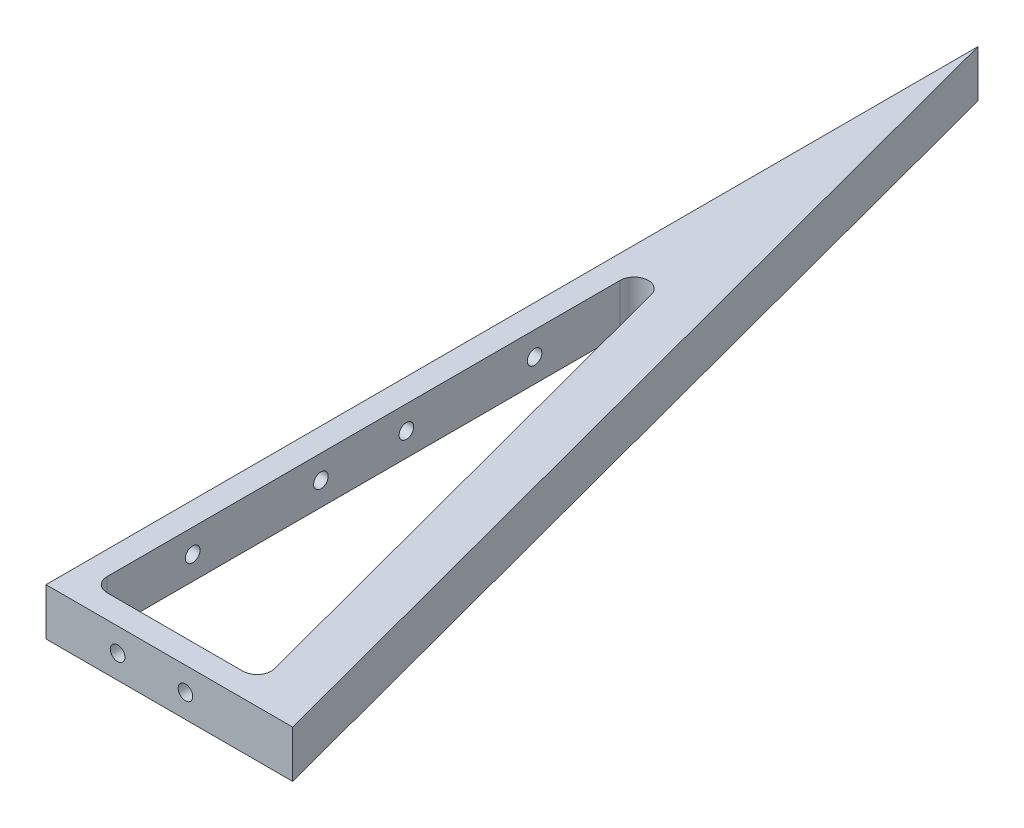
ISO-10303-21;
HEADER;
FILE_DESCRIPTION(('STEP AP214'),'2;1');
FILE_NAME('part.step','',(''),(''),'','','');
FILE_SCHEMA(('AUTOMOTIVE_DESIGN { 1 0 10303 214 1 1 1 1 }'));
ENDSEC;
DATA;
#1=APPLICATION_CONTEXT('core data for automotive mechanical design processes');
#2=APPLICATION_PROTOCOL_DEFINITION('international standard','automotive_design',2000,#1);
#3=PRODUCT_CONTEXT('',#1,'mechanical');
#4=PRODUCT('Part','Part','',(#3));
#5=PRODUCT_RELATED_PRODUCT_CATEGORY('part','',(#4));
#6=PRODUCT_DEFINITION_FORMATION('','',#4);
#7=PRODUCT_DEFINITION_CONTEXT('part definition',#1,'design');
#8=PRODUCT_DEFINITION('design','',#6,#7);
#9=PRODUCT_DEFINITION_SHAPE('','',#8);
#10=(LENGTH_UNIT() NAMED_UNIT(*) SI_UNIT(.MILLI.,.METRE.));
#11=(NAMED_UNIT(*) PLANE_ANGLE_UNIT() SI_UNIT($,.RADIAN.));
#12=(NAMED_UNIT(*) SI_UNIT($,.STERADIAN.) SOLID_ANGLE_UNIT());
#13=UNCERTAINTY_MEASURE_WITH_UNIT(LENGTH_MEASURE(1.E-05),#10,'distance_accuracy_value','');
#14=(GEOMETRIC_REPRESENTATION_CONTEXT(3) GLOBAL_UNCERTAINTY_ASSIGNED_CONTEXT((#13)) GLOBAL_UNIT_ASSIGNED_CONTEXT((#10,
#11,#12)) REPRESENTATION_CONTEXT('',''));
#15=CARTESIAN_POINT('',(0.,0.,0.));
#16=DIRECTION('',(0.,0.,1.));
#17=DIRECTION('',(1.,0.,0.));
#18=AXIS2_PLACEMENT_3D('',#15,#16,#17);
#19=CARTESIAN_POINT('',(0.,10.,0.));
#20=DIRECTION('',(0.,-1.,0.));
#21=DIRECTION('',(0.,0.,-1.));
#22=AXIS2_PLACEMENT_3D('',#19,#20,#21);
#23=PLANE('',#22);
#24=DIRECTION('',(1.,0.,0.));
#25=VECTOR('',#24,1.);
#26=CARTESIAN_POINT('',(52.4,10.,0.));
#27=LINE('',#26,#25);
#28=CARTESIAN_POINT('',(0.,10.,0.));
#29=VERTEX_POINT('',#28);
#30=CARTESIAN_POINT('',(52.4,10.,0.));
#31=VERTEX_POINT('',#30);
#32=EDGE_CURVE('E157',#29,#31,#27,.T.);
#33=ORIENTED_EDGE('',*,*,#32,.T.);
#34=DIRECTION('',(-0.255838880915375,0.,-0.966719435519928));
#35=VECTOR('',#34,1.);
#36=CARTESIAN_POINT('',(0.,10.,-198.));
#37=LINE('',#36,#35);
#38=CARTESIAN_POINT('',(0.,10.,-198.));
#39=VERTEX_POINT('',#38);
#40=EDGE_CURVE('E160',#31,#39,#37,.T.);
#41=ORIENTED_EDGE('',*,*,#40,.T.);
#42=DIRECTION('',(0.,0.,1.));
#43=VECTOR('',#42,1.);
#44=CARTESIAN_POINT('',(0.,10.,0.));
#45=LINE('',#44,#43);
#46=EDGE_CURVE('E163',#39,#29,#45,.T.);
#47=ORIENTED_EDGE('',*,*,#46,.T.);
#48=EDGE_LOOP('',(#33,#41,#47));
#49=FACE_BOUND('',#48,.T.);
#50=CARTESIAN_POINT('',(8.,10.,-116.957761971224));
#51=DIRECTION('',(0.,1.,0.));
#52=DIRECTION('',(0.,0.,-1.));
#53=AXIS2_PLACEMENT_3D('',#50,#51,#52);
#54=CIRCLE('',#53,3.);
#55=CARTESIAN_POINT('',(10.9001583065598,10.,-117.72527861397));
#56=VERTEX_POINT('',#55);
#57=CARTESIAN_POINT('',(5.,10.,-116.957761971224));
#58=VERTEX_POINT('',#57);
#59=EDGE_CURVE('E104',#56,#58,#54,.T.);
#60=ORIENTED_EDGE('',*,*,#59,.F.);
#61=DIRECTION('',(-0.255838880915375,0.,-0.966719435519928));
#62=VECTOR('',#61,1.);
#63=CARTESIAN_POINT('',(10.9001583065598,10.,-117.72527861397));
#64=LINE('',#63,#62);
#65=CARTESIAN_POINT('',(39.7354448080353,10.,-8.76751664274612));
#66=VERTEX_POINT('',#65);
#67=EDGE_CURVE('E134',#66,#56,#64,.T.);
#68=ORIENTED_EDGE('',*,*,#67,.F.);
#69=CARTESIAN_POINT('',(36.8352865014755,10.,-8.));
#70=DIRECTION('',(0.,1.,0.));
#71=DIRECTION('',(0.,0.,-1.));
#72=AXIS2_PLACEMENT_3D('',#69,#70,#71);
#73=CIRCLE('',#72,3.);
#74=CARTESIAN_POINT('',(36.8352865014755,10.,-5.));
#75=VERTEX_POINT('',#74);
#76=EDGE_CURVE('E132',#75,#66,#73,.T.);
#77=ORIENTED_EDGE('',*,*,#76,.F.);
#78=DIRECTION('',(1.,0.,0.));
#79=VECTOR('',#78,1.);
#80=CARTESIAN_POINT('',(36.8352865014755,10.,-5.));
#81=LINE('',#80,#79);
#82=CARTESIAN_POINT('',(8.,10.,-5.));
#83=VERTEX_POINT('',#82);
#84=EDGE_CURVE('E127',#83,#75,#81,.T.);
#85=ORIENTED_EDGE('',*,*,#84,.F.);
#86=CARTESIAN_POINT('',(8.,10.,-7.99999999999999));
#87=DIRECTION('',(0.,1.,0.));
#88=DIRECTION('',(0.,0.,1.));
#89=AXIS2_PLACEMENT_3D('',#86,#87,#88);
#90=CIRCLE('',#89,3.);
#91=CARTESIAN_POINT('',(5.,10.,-8.00000000000002));
#92=VERTEX_POINT('',#91);
#93=EDGE_CURVE('E125',#92,#83,#90,.T.);
#94=ORIENTED_EDGE('',*,*,#93,.F.);
#95=DIRECTION('',(0.,0.,1.));
#96=VECTOR('',#95,1.);
#97=CARTESIAN_POINT('',(5.,10.,-8.00000000000002));
#98=LINE('',#97,#96);
#99=EDGE_CURVE('E112',#58,#92,#98,.T.);
#100=ORIENTED_EDGE('',*,*,#99,.F.);
#101=EDGE_LOOP('',(#60,#68,#77,#85,#94,#100));
#102=FACE_BOUND('',#101,.T.);
#103=ADVANCED_FACE('F33',(#49,#102),#23,.F.);
#104=CARTESIAN_POINT('',(0.,0.,0.));
#105=DIRECTION('',(0.,-1.,0.));
#106=DIRECTION('',(0.,0.,-1.));
#107=AXIS2_PLACEMENT_3D('',#104,#105,#106);
#108=PLANE('',#107);
#109=DIRECTION('',(1.,0.,0.));
#110=VECTOR('',#109,1.);
#111=CARTESIAN_POINT('',(52.4,0.,0.));
#112=LINE('',#111,#110);
#113=CARTESIAN_POINT('',(0.,0.,0.));
#114=VERTEX_POINT('',#113);
#115=CARTESIAN_POINT('',(52.4,0.,0.));
#116=VERTEX_POINT('',#115);
#117=EDGE_CURVE('E120',#114,#116,#112,.T.);
#118=ORIENTED_EDGE('',*,*,#117,.F.);
#119=DIRECTION('',(0.,0.,1.));
#120=VECTOR('',#119,1.);
#121=CARTESIAN_POINT('',(0.,0.,0.));
#122=LINE('',#121,#120);
#123=CARTESIAN_POINT('',(0.,0.,-198.));
#124=VERTEX_POINT('',#123);
#125=EDGE_CURVE('E161',#124,#114,#122,.T.);
#126=ORIENTED_EDGE('',*,*,#125,.F.);
#127=DIRECTION('',(-0.255838880915375,0.,-0.966719435519928));
#128=VECTOR('',#127,1.);
#129=CARTESIAN_POINT('',(0.,0.,-198.));
#130=LINE('',#129,#128);
#131=EDGE_CURVE('E168',#116,#124,#130,.T.);
#132=ORIENTED_EDGE('',*,*,#131,.F.);
#133=EDGE_LOOP('',(#118,#126,#132));
#134=FACE_BOUND('',#133,.T.);
#135=DIRECTION('',(-0.255838880915375,0.,-0.966719435519928));
#136=VECTOR('',#135,1.);
#137=CARTESIAN_POINT('',(10.9001583065598,0.,-117.72527861397));
#138=LINE('',#137,#136);
#139=CARTESIAN_POINT('',(39.7354448080353,0.,-8.76751664274612));
#140=VERTEX_POINT('',#139);
#141=CARTESIAN_POINT('',(10.9001583065598,0.,-117.72527861397));
#142=VERTEX_POINT('',#141);
#143=EDGE_CURVE('E113',#140,#142,#138,.T.);
#144=ORIENTED_EDGE('',*,*,#143,.T.);
#145=CARTESIAN_POINT('',(8.,0.,-116.957761971224));
#146=DIRECTION('',(0.,1.,0.));
#147=DIRECTION('',(0.,0.,-1.));
#148=AXIS2_PLACEMENT_3D('',#145,#146,#147);
#149=CIRCLE('',#148,3.);
#150=CARTESIAN_POINT('',(5.,0.,-116.957761971224));
#151=VERTEX_POINT('',#150);
#152=EDGE_CURVE('E56',#142,#151,#149,.T.);
#153=ORIENTED_EDGE('',*,*,#152,.T.);
#154=DIRECTION('',(0.,0.,1.));
#155=VECTOR('',#154,1.);
#156=CARTESIAN_POINT('',(5.,0.,-8.00000000000002));
#157=LINE('',#156,#155);
#158=CARTESIAN_POINT('',(5.,0.,-8.00000000000002));
#159=VERTEX_POINT('',#158);
#160=EDGE_CURVE('E119',#151,#159,#157,.T.);
#161=ORIENTED_EDGE('',*,*,#160,.T.);
#162=CARTESIAN_POINT('',(8.,0.,-7.99999999999999));
#163=DIRECTION('',(0.,1.,0.));
#164=DIRECTION('',(0.,0.,1.));
#165=AXIS2_PLACEMENT_3D('',#162,#163,#164);
#166=CIRCLE('',#165,3.);
#167=CARTESIAN_POINT('',(8.,0.,-5.));
#168=VERTEX_POINT('',#167);
#169=EDGE_CURVE('E139',#159,#168,#166,.T.);
#170=ORIENTED_EDGE('',*,*,#169,.T.);
#171=DIRECTION('',(1.,0.,0.));
#172=VECTOR('',#171,1.);
#173=CARTESIAN_POINT('',(36.8352865014755,0.,-5.));
#174=LINE('',#173,#172);
#175=CARTESIAN_POINT('',(36.8352865014755,0.,-5.));
#176=VERTEX_POINT('',#175);
#177=EDGE_CURVE('E142',#168,#176,#174,.T.);
#178=ORIENTED_EDGE('',*,*,#177,.T.);
#179=CARTESIAN_POINT('',(36.8352865014755,0.,-8.));
#180=DIRECTION('',(0.,1.,0.));
#181=DIRECTION('',(0.,0.,-1.));
#182=AXIS2_PLACEMENT_3D('',#179,#180,#181);
#183=CIRCLE('',#182,3.);
#184=EDGE_CURVE('E145',#176,#140,#183,.T.);
#185=ORIENTED_EDGE('',*,*,#184,.T.);
#186=EDGE_LOOP('',(#144,#153,#161,#170,#178,#185));
#187=FACE_BOUND('',#186,.T.);
#188=ADVANCED_FACE('F182',(#134,#187),#108,.T.);
#189=CARTESIAN_POINT('',(52.4,10.,0.));
#190=DIRECTION('',(0.,0.,-1.));
#191=DIRECTION('',(-1.,0.,0.));
#192=AXIS2_PLACEMENT_3D('',#189,#190,#191);
#193=PLANE('',#192);
#194=CARTESIAN_POINT('',(15.2076432507378,5.,0.));
#195=DIRECTION('',(0.,0.,-1.));
#196=DIRECTION('',(-1.,0.,0.));
#197=AXIS2_PLACEMENT_3D('',#194,#195,#196);
#198=CIRCLE('',#197,1.55);
#199=CARTESIAN_POINT('',(13.6576432507378,5.,0.));
#200=VERTEX_POINT('',#199);
#201=EDGE_CURVE('E137',#200,#200,#198,.T.);
#202=ORIENTED_EDGE('',*,*,#201,.T.);
#203=EDGE_LOOP('',(#202));
#204=FACE_BOUND('',#203,.T.);
#205=CARTESIAN_POINT('',(29.6276432507378,5.,0.));
#206=DIRECTION('',(0.,0.,-1.));
#207=DIRECTION('',(-1.,0.,0.));
#208=AXIS2_PLACEMENT_3D('',#205,#206,#207);
#209=CIRCLE('',#208,1.55);
#210=CARTESIAN_POINT('',(28.0776432507378,5.,0.));
#211=VERTEX_POINT('',#210);
#212=EDGE_CURVE('E268',#211,#211,#209,.T.);
#213=ORIENTED_EDGE('',*,*,#212,.T.);
#214=EDGE_LOOP('',(#213));
#215=FACE_BOUND('',#214,.T.);
#216=ORIENTED_EDGE('',*,*,#117,.T.);
#217=DIRECTION('',(0.,-1.,0.));
#218=VECTOR('',#217,1.);
#219=CARTESIAN_POINT('',(52.4,10.,0.));
#220=LINE('',#219,#218);
#221=EDGE_CURVE('E11',#31,#116,#220,.T.);
#222=ORIENTED_EDGE('',*,*,#221,.F.);
#223=ORIENTED_EDGE('',*,*,#32,.F.);
#224=DIRECTION('',(0.,-1.,0.));
#225=VECTOR('',#224,1.);
#226=CARTESIAN_POINT('',(0.,10.,0.));
#227=LINE('',#226,#225);
#228=EDGE_CURVE('E165',#29,#114,#227,.T.);
#229=ORIENTED_EDGE('',*,*,#228,.T.);
#230=EDGE_LOOP('',(#216,#222,#223,#229));
#231=FACE_BOUND('',#230,.T.);
#232=ADVANCED_FACE('F35',(#204,#215,#231),#193,.F.);
#233=CARTESIAN_POINT('',(0.,10.,-198.));
#234=DIRECTION('',(-0.966719435519928,0.,0.255838880915375));
#235=DIRECTION('',(0.255838880915375,0.,0.966719435519928));
#236=AXIS2_PLACEMENT_3D('',#233,#234,#235);
#237=PLANE('',#236);
#238=ORIENTED_EDGE('',*,*,#131,.T.);
#239=DIRECTION('',(0.,-1.,0.));
#240=VECTOR('',#239,1.);
#241=CARTESIAN_POINT('',(0.,10.,-198.));
#242=LINE('',#241,#240);
#243=EDGE_CURVE('E41',#39,#124,#242,.T.);
#244=ORIENTED_EDGE('',*,*,#243,.F.);
#245=ORIENTED_EDGE('',*,*,#40,.F.);
#246=ORIENTED_EDGE('',*,*,#221,.T.);
#247=EDGE_LOOP('',(#238,#244,#245,#246));
#248=FACE_BOUND('',#247,.T.);
#249=ADVANCED_FACE('F188',(#248),#237,.F.);
#250=CARTESIAN_POINT('',(0.,10.,0.));
#251=DIRECTION('',(1.,0.,0.));
#252=DIRECTION('',(0.,0.,-1.));
#253=AXIS2_PLACEMENT_3D('',#250,#251,#252);
#254=PLANE('',#253);
#255=CARTESIAN_POINT('',(0.,5.00000000000001,-98.7977619712243));
#256=DIRECTION('',(1.,0.,0.));
#257=DIRECTION('',(0.,0.,-1.));
#258=AXIS2_PLACEMENT_3D('',#255,#256,#257);
#259=CIRCLE('',#258,1.54999999999999);
#260=CARTESIAN_POINT('',(0.,5.00000000000001,-100.347761971224));
#261=VERTEX_POINT('',#260);
#262=EDGE_CURVE('E255',#261,#261,#259,.T.);
#263=ORIENTED_EDGE('',*,*,#262,.T.);
#264=EDGE_LOOP('',(#263));
#265=FACE_BOUND('',#264,.T.);
#266=CARTESIAN_POINT('',(0.,5.00000000000001,-71.5577619712243));
#267=DIRECTION('',(1.,0.,0.));
#268=DIRECTION('',(0.,0.,-1.));
#269=AXIS2_PLACEMENT_3D('',#266,#267,#268);
#270=CIRCLE('',#269,1.54999999999999);
#271=CARTESIAN_POINT('',(0.,5.00000000000001,-73.1077619712243));
#272=VERTEX_POINT('',#271);
#273=EDGE_CURVE('E257',#272,#272,#270,.T.);
#274=ORIENTED_EDGE('',*,*,#273,.T.);
#275=EDGE_LOOP('',(#274));
#276=FACE_BOUND('',#275,.T.);
#277=CARTESIAN_POINT('',(0.,4.99999999999999,-53.4));
#278=DIRECTION('',(1.,0.,0.));
#279=DIRECTION('',(0.,0.,-1.));
#280=AXIS2_PLACEMENT_3D('',#277,#278,#279);
#281=CIRCLE('',#280,1.54999999999999);
#282=CARTESIAN_POINT('',(0.,4.99999999999999,-54.95));
#283=VERTEX_POINT('',#282);
#284=EDGE_CURVE('E263',#283,#283,#281,.T.);
#285=ORIENTED_EDGE('',*,*,#284,.T.);
#286=EDGE_LOOP('',(#285));
#287=FACE_BOUND('',#286,.T.);
#288=CARTESIAN_POINT('',(0.,5.,-26.16));
#289=DIRECTION('',(1.,0.,0.));
#290=DIRECTION('',(0.,0.,-1.));
#291=AXIS2_PLACEMENT_3D('',#288,#289,#290);
#292=CIRCLE('',#291,1.54999999999999);
#293=CARTESIAN_POINT('',(0.,5.,-27.71));
#294=VERTEX_POINT('',#293);
#295=EDGE_CURVE('E289',#294,#294,#292,.T.);
#296=ORIENTED_EDGE('',*,*,#295,.T.);
#297=EDGE_LOOP('',(#296));
#298=FACE_BOUND('',#297,.T.);
#299=ORIENTED_EDGE('',*,*,#125,.T.);
#300=ORIENTED_EDGE('',*,*,#228,.F.);
#301=ORIENTED_EDGE('',*,*,#46,.F.);
#302=ORIENTED_EDGE('',*,*,#243,.T.);
#303=EDGE_LOOP('',(#299,#300,#301,#302));
#304=FACE_BOUND('',#303,.T.);
#305=ADVANCED_FACE('F177',(#265,#276,#287,#298,#304),#254,.F.);
#306=CARTESIAN_POINT('',(8.,10.,-116.957761971224));
#307=DIRECTION('',(0.,-1.,0.));
#308=DIRECTION('',(0.,0.,-1.));
#309=AXIS2_PLACEMENT_3D('',#306,#307,#308);
#310=CYLINDRICAL_SURFACE('',#309,3.);
#311=ORIENTED_EDGE('',*,*,#152,.F.);
#312=DIRECTION('',(0.,-1.,0.));
#313=VECTOR('',#312,1.);
#314=CARTESIAN_POINT('',(10.9001583065598,10.,-117.72527861397));
#315=LINE('',#314,#313);
#316=EDGE_CURVE('E108',#56,#142,#315,.T.);
#317=ORIENTED_EDGE('',*,*,#316,.F.);
#318=ORIENTED_EDGE('',*,*,#59,.T.);
#319=DIRECTION('',(0.,-1.,0.));
#320=VECTOR('',#319,1.);
#321=CARTESIAN_POINT('',(5.,10.,-116.957761971224));
#322=LINE('',#321,#320);
#323=EDGE_CURVE('E107',#58,#151,#322,.T.);
#324=ORIENTED_EDGE('',*,*,#323,.T.);
#325=EDGE_LOOP('',(#311,#317,#318,#324));
#326=FACE_BOUND('',#325,.T.);
#327=ADVANCED_FACE('F106',(#326),#310,.F.);
#328=CARTESIAN_POINT('',(5.,10.,-8.00000000000002));
#329=DIRECTION('',(1.,0.,0.));
#330=DIRECTION('',(0.,0.,-1.));
#331=AXIS2_PLACEMENT_3D('',#328,#329,#330);
#332=PLANE('',#331);
#333=CARTESIAN_POINT('',(5.,5.00000000000001,-98.7977619712243));
#334=DIRECTION('',(1.,0.,0.));
#335=DIRECTION('',(0.,0.,-1.));
#336=AXIS2_PLACEMENT_3D('',#333,#334,#335);
#337=CIRCLE('',#336,1.54999999999999);
#338=CARTESIAN_POINT('',(5.,5.00000000000001,-100.347761971224));
#339=VERTEX_POINT('',#338);
#340=EDGE_CURVE('E252',#339,#339,#337,.T.);
#341=ORIENTED_EDGE('',*,*,#340,.F.);
#342=EDGE_LOOP('',(#341));
#343=FACE_BOUND('',#342,.T.);
#344=CARTESIAN_POINT('',(5.,5.00000000000001,-71.5577619712243));
#345=DIRECTION('',(1.,0.,0.));
#346=DIRECTION('',(0.,0.,-1.));
#347=AXIS2_PLACEMENT_3D('',#344,#345,#346);
#348=CIRCLE('',#347,1.54999999999999);
#349=CARTESIAN_POINT('',(5.,5.00000000000001,-73.1077619712243));
#350=VERTEX_POINT('',#349);
#351=EDGE_CURVE('E298',#350,#350,#348,.T.);
#352=ORIENTED_EDGE('',*,*,#351,.F.);
#353=EDGE_LOOP('',(#352));
#354=FACE_BOUND('',#353,.T.);
#355=CARTESIAN_POINT('',(5.,4.99999999999999,-53.4));
#356=DIRECTION('',(1.,0.,0.));
#357=DIRECTION('',(0.,0.,1.));
#358=AXIS2_PLACEMENT_3D('',#355,#356,#357);
#359=CIRCLE('',#358,1.54999999999999);
#360=CARTESIAN_POINT('',(5.,4.99999999999999,-51.8500000000001));
#361=VERTEX_POINT('',#360);
#362=EDGE_CURVE('E295',#361,#361,#359,.T.);
#363=ORIENTED_EDGE('',*,*,#362,.F.);
#364=EDGE_LOOP('',(#363));
#365=FACE_BOUND('',#364,.T.);
#366=CARTESIAN_POINT('',(5.,5.,-26.16));
#367=DIRECTION('',(1.,0.,0.));
#368=DIRECTION('',(0.,0.,1.));
#369=AXIS2_PLACEMENT_3D('',#366,#367,#368);
#370=CIRCLE('',#369,1.54999999999999);
#371=CARTESIAN_POINT('',(5.,5.,-24.61));
#372=VERTEX_POINT('',#371);
#373=EDGE_CURVE('E292',#372,#372,#370,.T.);
#374=ORIENTED_EDGE('',*,*,#373,.F.);
#375=EDGE_LOOP('',(#374));
#376=FACE_BOUND('',#375,.T.);
#377=ORIENTED_EDGE('',*,*,#160,.F.);
#378=ORIENTED_EDGE('',*,*,#323,.F.);
#379=ORIENTED_EDGE('',*,*,#99,.T.);
#380=DIRECTION('',(0.,-1.,0.));
#381=VECTOR('',#380,1.);
#382=CARTESIAN_POINT('',(5.,10.,-8.00000000000002));
#383=LINE('',#382,#381);
#384=EDGE_CURVE('E121',#92,#159,#383,.T.);
#385=ORIENTED_EDGE('',*,*,#384,.T.);
#386=EDGE_LOOP('',(#377,#378,#379,#385));
#387=FACE_BOUND('',#386,.T.);
#388=ADVANCED_FACE('F116',(#343,#354,#365,#376,#387),#332,.T.);
#389=CARTESIAN_POINT('',(8.,10.,-7.99999999999999));
#390=DIRECTION('',(0.,-1.,0.));
#391=DIRECTION('',(0.,0.,-1.));
#392=AXIS2_PLACEMENT_3D('',#389,#390,#391);
#393=CYLINDRICAL_SURFACE('',#392,3.);
#394=ORIENTED_EDGE('',*,*,#169,.F.);
#395=ORIENTED_EDGE('',*,*,#384,.F.);
#396=ORIENTED_EDGE('',*,*,#93,.T.);
#397=DIRECTION('',(0.,-1.,0.));
#398=VECTOR('',#397,1.);
#399=CARTESIAN_POINT('',(8.,10.,-5.));
#400=LINE('',#399,#398);
#401=EDGE_CURVE('E154',#83,#168,#400,.T.);
#402=ORIENTED_EDGE('',*,*,#401,.T.);
#403=EDGE_LOOP('',(#394,#395,#396,#402));
#404=FACE_BOUND('',#403,.T.);
#405=ADVANCED_FACE('F208',(#404),#393,.F.);
#406=CARTESIAN_POINT('',(36.8352865014755,10.,-5.));
#407=DIRECTION('',(0.,0.,-1.));
#408=DIRECTION('',(-1.,0.,0.));
#409=AXIS2_PLACEMENT_3D('',#406,#407,#408);
#410=PLANE('',#409);
#411=CARTESIAN_POINT('',(15.2076432507378,5.,-5.));
#412=DIRECTION('',(0.,0.,-1.));
#413=DIRECTION('',(-1.,0.,0.));
#414=AXIS2_PLACEMENT_3D('',#411,#412,#413);
#415=CIRCLE('',#414,1.55);
#416=CARTESIAN_POINT('',(13.6576432507378,5.,-5.));
#417=VERTEX_POINT('',#416);
#418=EDGE_CURVE('E260',#417,#417,#415,.T.);
#419=ORIENTED_EDGE('',*,*,#418,.F.);
#420=EDGE_LOOP('',(#419));
#421=FACE_BOUND('',#420,.T.);
#422=CARTESIAN_POINT('',(29.6276432507378,5.,-5.));
#423=DIRECTION('',(0.,0.,-1.));
#424=DIRECTION('',(-1.,0.,0.));
#425=AXIS2_PLACEMENT_3D('',#422,#423,#424);
#426=CIRCLE('',#425,1.55);
#427=CARTESIAN_POINT('',(28.0776432507378,5.,-5.));
#428=VERTEX_POINT('',#427);
#429=EDGE_CURVE('E256',#428,#428,#426,.T.);
#430=ORIENTED_EDGE('',*,*,#429,.F.);
#431=EDGE_LOOP('',(#430));
#432=FACE_BOUND('',#431,.T.);
#433=ORIENTED_EDGE('',*,*,#177,.F.);
#434=ORIENTED_EDGE('',*,*,#401,.F.);
#435=ORIENTED_EDGE('',*,*,#84,.T.);
#436=DIRECTION('',(0.,-1.,0.));
#437=VECTOR('',#436,1.);
#438=CARTESIAN_POINT('',(36.8352865014755,10.,-5.));
#439=LINE('',#438,#437);
#440=EDGE_CURVE('E152',#75,#176,#439,.T.);
#441=ORIENTED_EDGE('',*,*,#440,.T.);
#442=EDGE_LOOP('',(#433,#434,#435,#441));
#443=FACE_BOUND('',#442,.T.);
#444=ADVANCED_FACE('F212',(#421,#432,#443),#410,.T.);
#445=CARTESIAN_POINT('',(36.8352865014755,10.,-8.));
#446=DIRECTION('',(0.,-1.,0.));
#447=DIRECTION('',(0.,0.,-1.));
#448=AXIS2_PLACEMENT_3D('',#445,#446,#447);
#449=CYLINDRICAL_SURFACE('',#448,3.);
#450=ORIENTED_EDGE('',*,*,#184,.F.);
#451=ORIENTED_EDGE('',*,*,#440,.F.);
#452=ORIENTED_EDGE('',*,*,#76,.T.);
#453=DIRECTION('',(0.,-1.,0.));
#454=VECTOR('',#453,1.);
#455=CARTESIAN_POINT('',(39.7354448080353,10.,-8.76751664274612));
#456=LINE('',#455,#454);
#457=EDGE_CURVE('E48',#66,#140,#456,.T.);
#458=ORIENTED_EDGE('',*,*,#457,.T.);
#459=EDGE_LOOP('',(#450,#451,#452,#458));
#460=FACE_BOUND('',#459,.T.);
#461=ADVANCED_FACE('F216',(#460),#449,.F.);
#462=CARTESIAN_POINT('',(10.9001583065598,10.,-117.72527861397));
#463=DIRECTION('',(-0.966719435519928,0.,0.255838880915375));
#464=DIRECTION('',(0.255838880915375,0.,0.966719435519928));
#465=AXIS2_PLACEMENT_3D('',#462,#463,#464);
#466=PLANE('',#465);
#467=ORIENTED_EDGE('',*,*,#143,.F.);
#468=ORIENTED_EDGE('',*,*,#457,.F.);
#469=ORIENTED_EDGE('',*,*,#67,.T.);
#470=ORIENTED_EDGE('',*,*,#316,.T.);
#471=EDGE_LOOP('',(#467,#468,#469,#470));
#472=FACE_BOUND('',#471,.T.);
#473=ADVANCED_FACE('F220',(#472),#466,.T.);
#474=CARTESIAN_POINT('',(29.6276432507378,5.,1.99999999999999));
#475=DIRECTION('',(0.,0.,-1.));
#476=DIRECTION('',(-1.,0.,0.));
#477=AXIS2_PLACEMENT_3D('',#474,#475,#476);
#478=CYLINDRICAL_SURFACE('',#477,1.55);
#479=ORIENTED_EDGE('',*,*,#429,.T.);
#480=EDGE_LOOP('',(#479));
#481=FACE_BOUND('',#480,.T.);
#482=ORIENTED_EDGE('',*,*,#212,.F.);
#483=EDGE_LOOP('',(#482));
#484=FACE_BOUND('',#483,.T.);
#485=ADVANCED_FACE('F224',(#481,#484),#478,.F.);
#486=CARTESIAN_POINT('',(15.2076432507378,5.,2.));
#487=DIRECTION('',(0.,0.,-1.));
#488=DIRECTION('',(-1.,0.,0.));
#489=AXIS2_PLACEMENT_3D('',#486,#487,#488);
#490=CYLINDRICAL_SURFACE('',#489,1.55);
#491=ORIENTED_EDGE('',*,*,#418,.T.);
#492=EDGE_LOOP('',(#491));
#493=FACE_BOUND('',#492,.T.);
#494=ORIENTED_EDGE('',*,*,#201,.F.);
#495=EDGE_LOOP('',(#494));
#496=FACE_BOUND('',#495,.T.);
#497=ADVANCED_FACE('F227',(#493,#496),#490,.F.);
#498=CARTESIAN_POINT('',(-2.,5.,-26.16));
#499=DIRECTION('',(1.,0.,0.));
#500=DIRECTION('',(0.,0.,-1.));
#501=AXIS2_PLACEMENT_3D('',#498,#499,#500);
#502=CYLINDRICAL_SURFACE('',#501,1.54999999999999);
#503=ORIENTED_EDGE('',*,*,#373,.T.);
#504=EDGE_LOOP('',(#503));
#505=FACE_BOUND('',#504,.T.);
#506=ORIENTED_EDGE('',*,*,#295,.F.);
#507=EDGE_LOOP('',(#506));
#508=FACE_BOUND('',#507,.T.);
#509=ADVANCED_FACE('F231',(#505,#508),#502,.F.);
#510=CARTESIAN_POINT('',(-2.,4.99999999999999,-53.4));
#511=DIRECTION('',(1.,0.,0.));
#512=DIRECTION('',(0.,0.,-1.));
#513=AXIS2_PLACEMENT_3D('',#510,#511,#512);
#514=CYLINDRICAL_SURFACE('',#513,1.54999999999999);
#515=ORIENTED_EDGE('',*,*,#362,.T.);
#516=EDGE_LOOP('',(#515));
#517=FACE_BOUND('',#516,.T.);
#518=ORIENTED_EDGE('',*,*,#284,.F.);
#519=EDGE_LOOP('',(#518));
#520=FACE_BOUND('',#519,.T.);
#521=ADVANCED_FACE('F235',(#517,#520),#514,.F.);
#522=CARTESIAN_POINT('',(-2.,5.00000000000001,-71.5577619712243));
#523=DIRECTION('',(1.,0.,0.));
#524=DIRECTION('',(0.,0.,-1.));
#525=AXIS2_PLACEMENT_3D('',#522,#523,#524);
#526=CYLINDRICAL_SURFACE('',#525,1.54999999999999);
#527=ORIENTED_EDGE('',*,*,#351,.T.);
#528=EDGE_LOOP('',(#527));
#529=FACE_BOUND('',#528,.T.);
#530=ORIENTED_EDGE('',*,*,#273,.F.);
#531=EDGE_LOOP('',(#530));
#532=FACE_BOUND('',#531,.T.);
#533=ADVANCED_FACE('F239',(#529,#532),#526,.F.);
#534=CARTESIAN_POINT('',(-2.,5.00000000000001,-98.7977619712243));
#535=DIRECTION('',(1.,0.,0.));
#536=DIRECTION('',(0.,0.,-1.));
#537=AXIS2_PLACEMENT_3D('',#534,#535,#536);
#538=CYLINDRICAL_SURFACE('',#537,1.54999999999999);
#539=ORIENTED_EDGE('',*,*,#340,.T.);
#540=EDGE_LOOP('',(#539));
#541=FACE_BOUND('',#540,.T.);
#542=ORIENTED_EDGE('',*,*,#262,.F.);
#543=EDGE_LOOP('',(#542));
#544=FACE_BOUND('',#543,.T.);
#545=ADVANCED_FACE('F243',(#541,#544),#538,.F.);
#546=CLOSED_SHELL('',(#103,#188,#232,#249,#305,#327,#388,#405,#444,#461,#473,#485,#497,#509,
#521,#533,#545));
#547=MANIFOLD_SOLID_BREP('B2',#546);
#548=ADVANCED_BREP_SHAPE_REPRESENTATION('',(#18,#547),#14);
#549=SHAPE_DEFINITION_REPRESENTATION(#9,#548);
ENDSEC;
END-ISO-10303-21;
